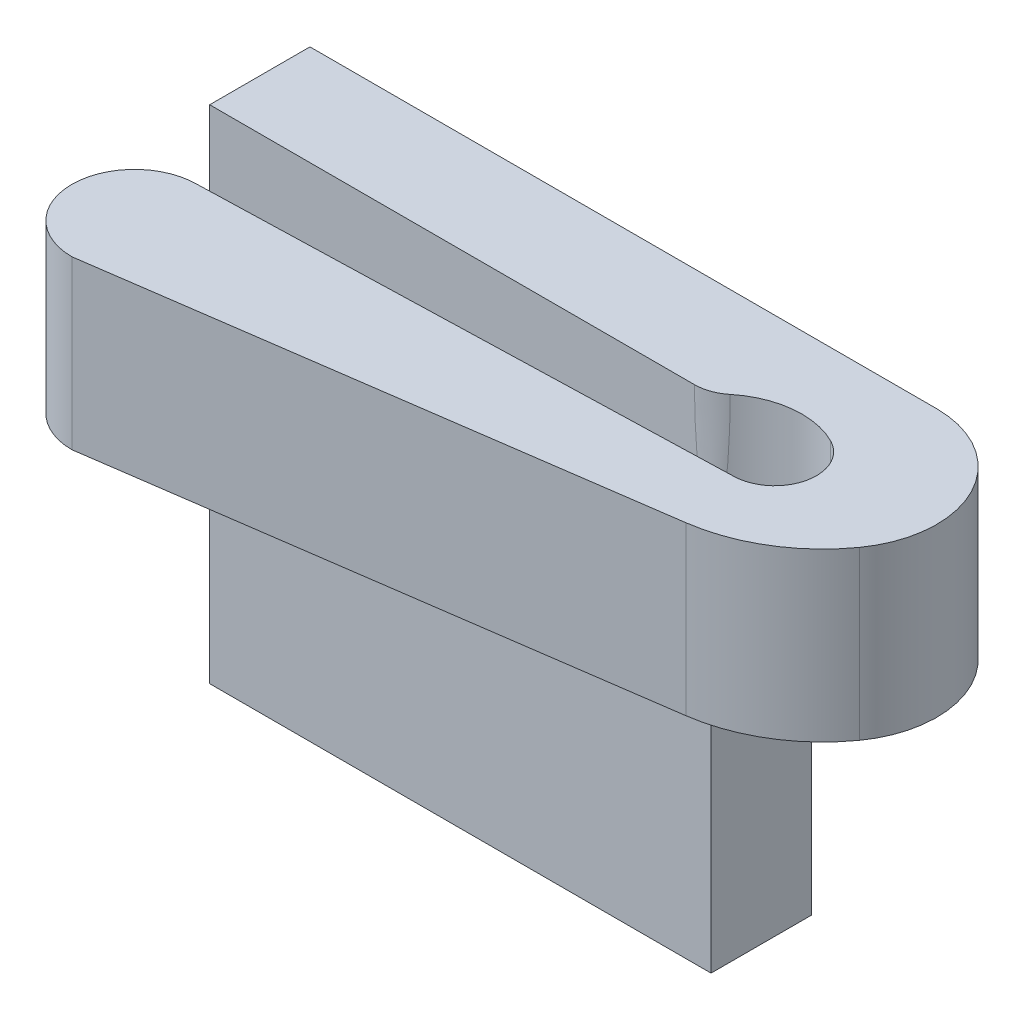
ISO-10303-21;
HEADER;
FILE_DESCRIPTION(('STEP AP214'),'2;1');
FILE_NAME('part.step','',(''),(''),'','','');
FILE_SCHEMA(('AUTOMOTIVE_DESIGN { 1 0 10303 214 1 1 1 1 }'));
ENDSEC;
DATA;
#1=APPLICATION_CONTEXT('core data for automotive mechanical design processes');
#2=APPLICATION_PROTOCOL_DEFINITION('international standard','automotive_design',2000,#1);
#3=PRODUCT_CONTEXT('',#1,'mechanical');
#4=PRODUCT('Part','Part','',(#3));
#5=PRODUCT_RELATED_PRODUCT_CATEGORY('part','',(#4));
#6=PRODUCT_DEFINITION_FORMATION('','',#4);
#7=PRODUCT_DEFINITION_CONTEXT('part definition',#1,'design');
#8=PRODUCT_DEFINITION('design','',#6,#7);
#9=PRODUCT_DEFINITION_SHAPE('','',#8);
#10=(LENGTH_UNIT() NAMED_UNIT(*) SI_UNIT(.MILLI.,.METRE.));
#11=(NAMED_UNIT(*) PLANE_ANGLE_UNIT() SI_UNIT($,.RADIAN.));
#12=(NAMED_UNIT(*) SI_UNIT($,.STERADIAN.) SOLID_ANGLE_UNIT());
#13=UNCERTAINTY_MEASURE_WITH_UNIT(LENGTH_MEASURE(1.E-05),#10,'distance_accuracy_value','');
#14=(GEOMETRIC_REPRESENTATION_CONTEXT(3) GLOBAL_UNCERTAINTY_ASSIGNED_CONTEXT((#13)) GLOBAL_UNIT_ASSIGNED_CONTEXT((#10,
#11,#12)) REPRESENTATION_CONTEXT('',''));
#15=CARTESIAN_POINT('',(0.,0.,0.));
#16=DIRECTION('',(0.,0.,1.));
#17=DIRECTION('',(1.,0.,0.));
#18=AXIS2_PLACEMENT_3D('',#15,#16,#17);
#19=CARTESIAN_POINT('',(6.75,0.,0.661437827766148));
#20=DIRECTION('',(0.,-1.,0.));
#21=DIRECTION('',(0.,0.,-1.));
#22=AXIS2_PLACEMENT_3D('',#19,#20,#21);
#23=PLANE('',#22);
#24=CARTESIAN_POINT('',(6.75,0.,0.661437827766148));
#25=DIRECTION('',(0.,-1.,0.));
#26=DIRECTION('',(0.,0.,-1.));
#27=AXIS2_PLACEMENT_3D('',#24,#25,#26);
#28=CIRCLE('',#27,1.);
#29=CARTESIAN_POINT('',(6.,0.,0.));
#30=VERTEX_POINT('',#29);
#31=CARTESIAN_POINT('',(7.20154343899828,0.,-0.23081130935734));
#32=VERTEX_POINT('',#31);
#33=EDGE_CURVE('E135',#30,#32,#28,.T.);
#34=ORIENTED_EDGE('',*,*,#33,.F.);
#35=DIRECTION('',(0.,0.,-1.));
#36=VECTOR('',#35,1.);
#37=CARTESIAN_POINT('',(6.,0.,0.));
#38=LINE('',#37,#36);
#39=CARTESIAN_POINT('',(6.,0.,-1.2));
#40=VERTEX_POINT('',#39);
#41=EDGE_CURVE('E132',#30,#40,#38,.T.);
#42=ORIENTED_EDGE('',*,*,#41,.T.);
#43=DIRECTION('',(-1.,0.,0.));
#44=VECTOR('',#43,1.);
#45=CARTESIAN_POINT('',(0.,0.,-1.2));
#46=LINE('',#45,#44);
#47=CARTESIAN_POINT('',(7.5,0.,-1.2));
#48=VERTEX_POINT('',#47);
#49=EDGE_CURVE('E162',#48,#40,#46,.T.);
#50=ORIENTED_EDGE('',*,*,#49,.F.);
#51=CARTESIAN_POINT('',(7.5,0.,0.));
#52=DIRECTION('',(0.,1.,0.));
#53=DIRECTION('',(0.,0.,-1.));
#54=AXIS2_PLACEMENT_3D('',#51,#52,#53);
#55=CIRCLE('',#54,1.2);
#56=CARTESIAN_POINT('',(8.4746794344809,0.,0.7));
#57=VERTEX_POINT('',#56);
#58=EDGE_CURVE('E267',#57,#48,#55,.T.);
#59=ORIENTED_EDGE('',*,*,#58,.F.);
#60=CARTESIAN_POINT('',(6.91322451145057,0.,-0.421413264150131));
#61=DIRECTION('',(0.,1.,0.));
#62=DIRECTION('',(0.,0.,-1.));
#63=AXIS2_PLACEMENT_3D('',#60,#61,#62);
#64=CIRCLE('',#63,1.92242273854308);
#65=CARTESIAN_POINT('',(7.1848098971319,0.,1.48172902268809));
#66=VERTEX_POINT('',#65);
#67=EDGE_CURVE('E265',#66,#57,#64,.T.);
#68=ORIENTED_EDGE('',*,*,#67,.F.);
#69=DIRECTION('',(0.989970753404907,0.,-0.141272458047986));
#70=VECTOR('',#69,1.);
#71=CARTESIAN_POINT('',(0.75,0.,2.4));
#72=LINE('',#71,#70);
#73=CARTESIAN_POINT('',(0.75,0.,2.4));
#74=VERTEX_POINT('',#73);
#75=EDGE_CURVE('E258',#74,#66,#72,.T.);
#76=ORIENTED_EDGE('',*,*,#75,.F.);
#77=CARTESIAN_POINT('',(0.75,0.,1.65));
#78=DIRECTION('',(0.,1.,0.));
#79=DIRECTION('',(0.,0.,1.));
#80=AXIS2_PLACEMENT_3D('',#77,#78,#79);
#81=CIRCLE('',#80,0.75);
#82=CARTESIAN_POINT('',(0.75,0.,0.9));
#83=VERTEX_POINT('',#82);
#84=EDGE_CURVE('E254',#83,#74,#81,.T.);
#85=ORIENTED_EDGE('',*,*,#84,.F.);
#86=DIRECTION('',(-0.999561331338217,0.,0.0296166320396508));
#87=VECTOR('',#86,1.);
#88=CARTESIAN_POINT('',(0.75,0.,0.9));
#89=LINE('',#88,#87);
#90=CARTESIAN_POINT('',(6.99058003551897,0.,0.715093924873512));
#91=VERTEX_POINT('',#90);
#92=EDGE_CURVE('E253',#91,#83,#89,.T.);
#93=ORIENTED_EDGE('',*,*,#92,.F.);
#94=CARTESIAN_POINT('',(6.97577171949914,0.,0.215313259204404));
#95=DIRECTION('',(0.,-1.,0.));
#96=DIRECTION('',(0.,0.,-1.));
#97=AXIS2_PLACEMENT_3D('',#94,#95,#96);
#98=CIRCLE('',#97,0.5);
#99=EDGE_CURVE('E45',#91,#32,#98,.F.);
#100=ORIENTED_EDGE('',*,*,#99,.T.);
#101=EDGE_LOOP('',(#34,#42,#50,#59,#68,#76,#85,#93,#100));
#102=FACE_BOUND('',#101,.T.);
#103=ADVANCED_FACE('F37',(#102),#23,.T.);
#104=CARTESIAN_POINT('',(0.,2.,-1.2));
#105=DIRECTION('',(1.,0.,0.));
#106=DIRECTION('',(0.,0.,-1.));
#107=AXIS2_PLACEMENT_3D('',#104,#105,#106);
#108=PLANE('',#107);
#109=DIRECTION('',(0.,-1.,0.));
#110=VECTOR('',#109,1.);
#111=CARTESIAN_POINT('',(0.,2.,-1.2));
#112=LINE('',#111,#110);
#113=CARTESIAN_POINT('',(0.,2.,-1.2));
#114=VERTEX_POINT('',#113);
#115=CARTESIAN_POINT('',(0.,-4.,-1.2));
#116=VERTEX_POINT('',#115);
#117=EDGE_CURVE('E271',#114,#116,#112,.T.);
#118=ORIENTED_EDGE('',*,*,#117,.T.);
#119=DIRECTION('',(0.,0.,-1.));
#120=VECTOR('',#119,1.);
#121=CARTESIAN_POINT('',(0.,-4.,0.));
#122=LINE('',#121,#120);
#123=CARTESIAN_POINT('',(0.,-4.,0.));
#124=VERTEX_POINT('',#123);
#125=EDGE_CURVE('E146',#124,#116,#122,.T.);
#126=ORIENTED_EDGE('',*,*,#125,.F.);
#127=DIRECTION('',(0.,-1.,0.));
#128=VECTOR('',#127,1.);
#129=CARTESIAN_POINT('',(0.,2.,0.));
#130=LINE('',#129,#128);
#131=CARTESIAN_POINT('',(0.,2.,0.));
#132=VERTEX_POINT('',#131);
#133=EDGE_CURVE('E142',#132,#124,#130,.T.);
#134=ORIENTED_EDGE('',*,*,#133,.F.);
#135=DIRECTION('',(0.,0.,1.));
#136=VECTOR('',#135,1.);
#137=CARTESIAN_POINT('',(0.,2.,-1.2));
#138=LINE('',#137,#136);
#139=EDGE_CURVE('E158',#114,#132,#138,.T.);
#140=ORIENTED_EDGE('',*,*,#139,.F.);
#141=EDGE_LOOP('',(#118,#126,#134,#140));
#142=FACE_BOUND('',#141,.T.);
#143=ADVANCED_FACE('F191',(#142),#108,.F.);
#144=CARTESIAN_POINT('',(0.,2.,0.));
#145=DIRECTION('',(0.,0.,-1.));
#146=DIRECTION('',(-1.,0.,0.));
#147=AXIS2_PLACEMENT_3D('',#144,#145,#146);
#148=PLANE('',#147);
#149=ORIENTED_EDGE('',*,*,#133,.T.);
#150=DIRECTION('',(-1.,0.,0.));
#151=VECTOR('',#150,1.);
#152=CARTESIAN_POINT('',(0.,-4.,0.));
#153=LINE('',#152,#151);
#154=CARTESIAN_POINT('',(6.,-4.,0.));
#155=VERTEX_POINT('',#154);
#156=EDGE_CURVE('E139',#155,#124,#153,.T.);
#157=ORIENTED_EDGE('',*,*,#156,.F.);
#158=DIRECTION('',(0.,1.,0.));
#159=VECTOR('',#158,1.);
#160=CARTESIAN_POINT('',(6.,-4.,0.));
#161=LINE('',#160,#159);
#162=EDGE_CURVE('E126',#155,#30,#161,.T.);
#163=ORIENTED_EDGE('',*,*,#162,.T.);
#164=CARTESIAN_POINT('',(5.80075705310292,2.1,0.));
#165=CARTESIAN_POINT('',(5.80075705310292,2.0125,0.));
#166=CARTESIAN_POINT('',(5.80064889285179,1.925,0.));
#167=CARTESIAN_POINT('',(5.80430449907036,1.75,0.));
#168=CARTESIAN_POINT('',(5.80754898956653,1.6625,0.));
#169=CARTESIAN_POINT('',(5.82104555414479,1.4,0.));
#170=CARTESIAN_POINT('',(5.8350504592648,1.225,0.));
#171=CARTESIAN_POINT('',(5.88887699381918,0.7,0.));
#172=CARTESIAN_POINT('',(5.94074877315835,0.350016775933248,0.));
#173=CARTESIAN_POINT('',(6.,0.,0.));
#174=(BOUNDED_CURVE() B_SPLINE_CURVE(3,(#164,#165,#166,#167,#168,#169,#170,#171,#172,#173),
.UNSPECIFIED.,.F.,.F.) B_SPLINE_CURVE_WITH_KNOTS((4,2,2,2,4),(-0.0001,0.0001625,0.000425,
0.00095,0.002),
.UNSPECIFIED.) CURVE() GEOMETRIC_REPRESENTATION_ITEM() RATIONAL_B_SPLINE_CURVE((1.,1.,1.,1.,1.,
0.999999999999999,0.999999999999999,0.999999999999999,0.999999999999999,0.999999999999999)) REPRESENTATION_ITEM(''));
#175=CARTESIAN_POINT('',(5.80082297353879,2.,0.));
#176=VERTEX_POINT('',#175);
#177=EDGE_CURVE('E175',#30,#176,#174,.F.);
#178=ORIENTED_EDGE('',*,*,#177,.T.);
#179=DIRECTION('',(1.,0.,0.));
#180=VECTOR('',#179,1.);
#181=CARTESIAN_POINT('',(0.,2.,0.));
#182=LINE('',#181,#180);
#183=EDGE_CURVE('E161',#132,#176,#182,.T.);
#184=ORIENTED_EDGE('',*,*,#183,.F.);
#185=EDGE_LOOP('',(#149,#157,#163,#178,#184));
#186=FACE_BOUND('',#185,.T.);
#187=ADVANCED_FACE('F140',(#186),#148,.F.);
#188=CARTESIAN_POINT('',(6.75,2.,0.661437827766148));
#189=DIRECTION('',(0.,-1.,0.));
#190=DIRECTION('',(0.,0.,-1.));
#191=AXIS2_PLACEMENT_3D('',#188,#189,#190);
#192=CYLINDRICAL_SURFACE('',#191,1.);
#193=ORIENTED_EDGE('',*,*,#33,.T.);
#194=DIRECTION('',(0.,-1.,0.));
#195=VECTOR('',#194,1.);
#196=CARTESIAN_POINT('',(7.20154343899828,2.,-0.23081130935734));
#197=LINE('',#196,#195);
#198=CARTESIAN_POINT('',(7.20154343899828,2.,-0.23081130935734));
#199=VERTEX_POINT('',#198);
#200=EDGE_CURVE('E58',#32,#199,#197,.F.);
#201=ORIENTED_EDGE('',*,*,#200,.T.);
#202=CARTESIAN_POINT('',(6.75,2.,0.661437827766148));
#203=DIRECTION('',(0.,-1.,0.));
#204=DIRECTION('',(0.,0.,-1.));
#205=AXIS2_PLACEMENT_3D('',#202,#203,#204);
#206=CIRCLE('',#205,1.);
#207=CARTESIAN_POINT('',(6.11713769666248,2.,-0.112826536010414));
#208=VERTEX_POINT('',#207);
#209=EDGE_CURVE('E171',#208,#199,#206,.T.);
#210=ORIENTED_EDGE('',*,*,#209,.F.);
#211=CARTESIAN_POINT('',(6.,0.,0.));
#212=CARTESIAN_POINT('',(6.03918871012658,0.349996349409683,-0.0444358205127169));
#213=CARTESIAN_POINT('',(6.06941650390479,0.7,-0.0717093557990268));
#214=CARTESIAN_POINT('',(6.09917757893462,1.225,-0.0979071848732168));
#215=CARTESIAN_POINT('',(6.10658490223356,1.4,-0.104104171234956));
#216=CARTESIAN_POINT('',(6.11365659452814,1.6625,-0.109974160330728));
#217=CARTESIAN_POINT('',(6.11533703401786,1.75,-0.111352191593892));
#218=CARTESIAN_POINT('',(6.11722833993481,1.925,-0.112901581427313));
#219=CARTESIAN_POINT('',(6.11717136873528,2.0125,-0.112854057411283));
#220=CARTESIAN_POINT('',(6.11717136873528,2.1,-0.112854057411283));
#221=(BOUNDED_CURVE() B_SPLINE_CURVE(3,(#211,#212,#213,#214,#215,#216,#217,#218,#219,#220),
.UNSPECIFIED.,.F.,.F.) B_SPLINE_CURVE_WITH_KNOTS((4,2,2,2,4),(-0.0001,0.00095,0.001475,
0.0017375,0.002),
.UNSPECIFIED.) CURVE() GEOMETRIC_REPRESENTATION_ITEM() RATIONAL_B_SPLINE_CURVE((1.,1.,1.,1.,1.,
1.,1.,1.,1.,1.)) REPRESENTATION_ITEM(''));
#222=EDGE_CURVE('E231',#208,#30,#221,.F.);
#223=ORIENTED_EDGE('',*,*,#222,.T.);
#224=EDGE_LOOP('',(#193,#201,#210,#223));
#225=FACE_BOUND('',#224,.T.);
#226=ADVANCED_FACE('F190',(#225),#192,.F.);
#227=CARTESIAN_POINT('',(0.75,2.,0.9));
#228=DIRECTION('',(0.0296166320396508,0.,0.999561331338217));
#229=DIRECTION('',(0.999561331338217,0.,-0.0296166320396508));
#230=AXIS2_PLACEMENT_3D('',#227,#228,#229);
#231=PLANE('',#230);
#232=DIRECTION('',(-0.999561331338217,0.,0.0296166320396508));
#233=VECTOR('',#232,1.);
#234=CARTESIAN_POINT('',(0.75,2.,0.9));
#235=LINE('',#234,#233);
#236=CARTESIAN_POINT('',(6.99058003551897,2.,0.715093924873512));
#237=VERTEX_POINT('',#236);
#238=CARTESIAN_POINT('',(0.75,2.,0.9));
#239=VERTEX_POINT('',#238);
#240=EDGE_CURVE('E244',#237,#239,#235,.T.);
#241=ORIENTED_EDGE('',*,*,#240,.F.);
#242=DIRECTION('',(0.,1.,0.));
#243=VECTOR('',#242,1.);
#244=CARTESIAN_POINT('',(6.99058003551896,2.,0.715093924873512));
#245=LINE('',#244,#243);
#246=EDGE_CURVE('E233',#237,#91,#245,.F.);
#247=ORIENTED_EDGE('',*,*,#246,.T.);
#248=ORIENTED_EDGE('',*,*,#92,.T.);
#249=DIRECTION('',(0.,-1.,0.));
#250=VECTOR('',#249,1.);
#251=CARTESIAN_POINT('',(0.75,2.,0.9));
#252=LINE('',#251,#250);
#253=EDGE_CURVE('E237',#239,#83,#252,.T.);
#254=ORIENTED_EDGE('',*,*,#253,.F.);
#255=EDGE_LOOP('',(#241,#247,#248,#254));
#256=FACE_BOUND('',#255,.T.);
#257=ADVANCED_FACE('F313',(#256),#231,.F.);
#258=CARTESIAN_POINT('',(0.75,2.,1.65));
#259=DIRECTION('',(0.,-1.,0.));
#260=DIRECTION('',(0.,0.,-1.));
#261=AXIS2_PLACEMENT_3D('',#258,#259,#260);
#262=CYLINDRICAL_SURFACE('',#261,0.75);
#263=ORIENTED_EDGE('',*,*,#84,.T.);
#264=DIRECTION('',(0.,-1.,0.));
#265=VECTOR('',#264,1.);
#266=CARTESIAN_POINT('',(0.75,2.,2.4));
#267=LINE('',#266,#265);
#268=CARTESIAN_POINT('',(0.75,2.,2.4));
#269=VERTEX_POINT('',#268);
#270=EDGE_CURVE('E240',#269,#74,#267,.T.);
#271=ORIENTED_EDGE('',*,*,#270,.F.);
#272=CARTESIAN_POINT('',(0.75,2.,1.65));
#273=DIRECTION('',(0.,1.,0.));
#274=DIRECTION('',(0.,0.,1.));
#275=AXIS2_PLACEMENT_3D('',#272,#273,#274);
#276=CIRCLE('',#275,0.75);
#277=EDGE_CURVE('E309',#239,#269,#276,.T.);
#278=ORIENTED_EDGE('',*,*,#277,.F.);
#279=ORIENTED_EDGE('',*,*,#253,.T.);
#280=EDGE_LOOP('',(#263,#271,#278,#279));
#281=FACE_BOUND('',#280,.T.);
#282=ADVANCED_FACE('F314',(#281),#262,.T.);
#283=CARTESIAN_POINT('',(0.75,2.,2.4));
#284=DIRECTION('',(-0.141272458047986,0.,-0.989970753404907));
#285=DIRECTION('',(-0.989970753404907,0.,0.141272458047986));
#286=AXIS2_PLACEMENT_3D('',#283,#284,#285);
#287=PLANE('',#286);
#288=ORIENTED_EDGE('',*,*,#75,.T.);
#289=DIRECTION('',(0.,-1.,0.));
#290=VECTOR('',#289,1.);
#291=CARTESIAN_POINT('',(7.1848098971319,2.,1.48172902268809));
#292=LINE('',#291,#290);
#293=CARTESIAN_POINT('',(7.1848098971319,2.,1.48172902268809));
#294=VERTEX_POINT('',#293);
#295=EDGE_CURVE('E279',#294,#66,#292,.T.);
#296=ORIENTED_EDGE('',*,*,#295,.F.);
#297=DIRECTION('',(0.989970753404907,0.,-0.141272458047986));
#298=VECTOR('',#297,1.);
#299=CARTESIAN_POINT('',(0.75,2.,2.4));
#300=LINE('',#299,#298);
#301=EDGE_CURVE('E288',#269,#294,#300,.T.);
#302=ORIENTED_EDGE('',*,*,#301,.F.);
#303=ORIENTED_EDGE('',*,*,#270,.T.);
#304=EDGE_LOOP('',(#288,#296,#302,#303));
#305=FACE_BOUND('',#304,.T.);
#306=ADVANCED_FACE('F286',(#305),#287,.F.);
#307=CARTESIAN_POINT('',(6.91322451145057,2.,-0.421413264150131));
#308=DIRECTION('',(0.,-1.,0.));
#309=DIRECTION('',(0.,0.,-1.));
#310=AXIS2_PLACEMENT_3D('',#307,#308,#309);
#311=CYLINDRICAL_SURFACE('',#310,1.92242273854308);
#312=ORIENTED_EDGE('',*,*,#67,.T.);
#313=DIRECTION('',(0.,-1.,0.));
#314=VECTOR('',#313,1.);
#315=CARTESIAN_POINT('',(8.4746794344809,2.,0.7));
#316=LINE('',#315,#314);
#317=CARTESIAN_POINT('',(8.4746794344809,2.,0.7));
#318=VERTEX_POINT('',#317);
#319=EDGE_CURVE('E276',#318,#57,#316,.T.);
#320=ORIENTED_EDGE('',*,*,#319,.F.);
#321=CARTESIAN_POINT('',(6.91322451145057,2.,-0.421413264150131));
#322=DIRECTION('',(0.,1.,0.));
#323=DIRECTION('',(0.,0.,-1.));
#324=AXIS2_PLACEMENT_3D('',#321,#322,#323);
#325=CIRCLE('',#324,1.92242273854308);
#326=EDGE_CURVE('E305',#294,#318,#325,.T.);
#327=ORIENTED_EDGE('',*,*,#326,.F.);
#328=ORIENTED_EDGE('',*,*,#295,.T.);
#329=EDGE_LOOP('',(#312,#320,#327,#328));
#330=FACE_BOUND('',#329,.T.);
#331=ADVANCED_FACE('F297',(#330),#311,.T.);
#332=CARTESIAN_POINT('',(7.5,2.,0.));
#333=DIRECTION('',(0.,-1.,0.));
#334=DIRECTION('',(0.,0.,-1.));
#335=AXIS2_PLACEMENT_3D('',#332,#333,#334);
#336=CYLINDRICAL_SURFACE('',#335,1.2);
#337=ORIENTED_EDGE('',*,*,#58,.T.);
#338=DIRECTION('',(0.,-1.,0.));
#339=VECTOR('',#338,1.);
#340=CARTESIAN_POINT('',(7.5,2.,-1.2));
#341=LINE('',#340,#339);
#342=CARTESIAN_POINT('',(7.5,2.,-1.2));
#343=VERTEX_POINT('',#342);
#344=EDGE_CURVE('E273',#343,#48,#341,.T.);
#345=ORIENTED_EDGE('',*,*,#344,.F.);
#346=CARTESIAN_POINT('',(7.5,2.,0.));
#347=DIRECTION('',(0.,1.,0.));
#348=DIRECTION('',(0.,0.,-1.));
#349=AXIS2_PLACEMENT_3D('',#346,#347,#348);
#350=CIRCLE('',#349,1.2);
#351=EDGE_CURVE('E303',#318,#343,#350,.T.);
#352=ORIENTED_EDGE('',*,*,#351,.F.);
#353=ORIENTED_EDGE('',*,*,#319,.T.);
#354=EDGE_LOOP('',(#337,#345,#352,#353));
#355=FACE_BOUND('',#354,.T.);
#356=ADVANCED_FACE('F301',(#355),#336,.T.);
#357=CARTESIAN_POINT('',(0.,2.,-1.2));
#358=DIRECTION('',(0.,0.,1.));
#359=DIRECTION('',(1.,0.,0.));
#360=AXIS2_PLACEMENT_3D('',#357,#358,#359);
#361=PLANE('',#360);
#362=ORIENTED_EDGE('',*,*,#49,.T.);
#363=DIRECTION('',(0.,1.,0.));
#364=VECTOR('',#363,1.);
#365=CARTESIAN_POINT('',(6.,-4.,-1.2));
#366=LINE('',#365,#364);
#367=CARTESIAN_POINT('',(6.,-4.,-1.2));
#368=VERTEX_POINT('',#367);
#369=EDGE_CURVE('E136',#368,#40,#366,.T.);
#370=ORIENTED_EDGE('',*,*,#369,.F.);
#371=DIRECTION('',(1.,0.,0.));
#372=VECTOR('',#371,1.);
#373=CARTESIAN_POINT('',(0.,-4.,-1.2));
#374=LINE('',#373,#372);
#375=EDGE_CURVE('E150',#116,#368,#374,.T.);
#376=ORIENTED_EDGE('',*,*,#375,.F.);
#377=ORIENTED_EDGE('',*,*,#117,.F.);
#378=DIRECTION('',(-1.,0.,0.));
#379=VECTOR('',#378,1.);
#380=CARTESIAN_POINT('',(0.,2.,-1.2));
#381=LINE('',#380,#379);
#382=EDGE_CURVE('E261',#343,#114,#381,.T.);
#383=ORIENTED_EDGE('',*,*,#382,.F.);
#384=ORIENTED_EDGE('',*,*,#344,.T.);
#385=EDGE_LOOP('',(#362,#370,#376,#377,#383,#384));
#386=FACE_BOUND('',#385,.T.);
#387=ADVANCED_FACE('F330',(#386),#361,.F.);
#388=CARTESIAN_POINT('',(6.75,2.,0.661437827766148));
#389=DIRECTION('',(0.,-1.,0.));
#390=DIRECTION('',(0.,0.,-1.));
#391=AXIS2_PLACEMENT_3D('',#388,#389,#390);
#392=PLANE('',#391);
#393=ORIENTED_EDGE('',*,*,#183,.T.);
#394=CARTESIAN_POINT('',(6.11713759325136,2.00000087234566,-0.112826664770482));
#395=CARTESIAN_POINT('',(5.97910242573817,1.99999729287675,0.));
#396=CARTESIAN_POINT('',(5.80082297140286,2.00000087234566,0.));
#397=(BOUNDED_CURVE() B_SPLINE_CURVE(2,(#394,#395,#396),.UNSPECIFIED.,.F.,
.F.) B_SPLINE_CURVE_WITH_KNOTS((3,3),(0.,1.),
.UNSPECIFIED.) CURVE() GEOMETRIC_REPRESENTATION_ITEM() RATIONAL_B_SPLINE_CURVE((1.,
0.941876985398978,1.)) REPRESENTATION_ITEM(''));
#398=EDGE_CURVE('E229',#176,#208,#397,.F.);
#399=ORIENTED_EDGE('',*,*,#398,.T.);
#400=ORIENTED_EDGE('',*,*,#209,.T.);
#401=CARTESIAN_POINT('',(6.97577171949914,2.,0.215313259204404));
#402=DIRECTION('',(0.,-1.,0.));
#403=DIRECTION('',(0.,0.,-1.));
#404=AXIS2_PLACEMENT_3D('',#401,#402,#403);
#405=CIRCLE('',#404,0.5);
#406=EDGE_CURVE('E11',#199,#237,#405,.T.);
#407=ORIENTED_EDGE('',*,*,#406,.T.);
#408=ORIENTED_EDGE('',*,*,#240,.T.);
#409=ORIENTED_EDGE('',*,*,#277,.T.);
#410=ORIENTED_EDGE('',*,*,#301,.T.);
#411=ORIENTED_EDGE('',*,*,#326,.T.);
#412=ORIENTED_EDGE('',*,*,#351,.T.);
#413=ORIENTED_EDGE('',*,*,#382,.T.);
#414=ORIENTED_EDGE('',*,*,#139,.T.);
#415=EDGE_LOOP('',(#393,#399,#400,#407,#408,#409,#410,#411,#412,#413,#414));
#416=FACE_BOUND('',#415,.T.);
#417=ADVANCED_FACE('F203',(#416),#392,.F.);
#418=CARTESIAN_POINT('',(6.11717136873528,2.1,-0.112854057411283));
#419=CARTESIAN_POINT('',(6.11717136873528,2.0125,-0.112854057411283));
#420=CARTESIAN_POINT('',(6.11722833993481,1.925,-0.112901581427313));
#421=CARTESIAN_POINT('',(6.11533703401786,1.75,-0.111352191593892));
#422=CARTESIAN_POINT('',(6.11365659452814,1.6625,-0.109974160330728));
#423=CARTESIAN_POINT('',(6.10658490223356,1.4,-0.104104171234956));
#424=CARTESIAN_POINT('',(6.09917757893462,1.225,-0.0979071848732168));
#425=CARTESIAN_POINT('',(6.06941650390479,0.7,-0.0717093557990268));
#426=CARTESIAN_POINT('',(6.03918871012658,0.349996349409683,-0.0444358205127169));
#427=CARTESIAN_POINT('',(6.,0.,0.));
#428=CARTESIAN_POINT('',(5.97908978306449,2.1,0.));
#429=CARTESIAN_POINT('',(5.97908978306449,2.01249999999999,0.));
#430=CARTESIAN_POINT('',(5.97907063634323,1.92498089412601,0.));
#431=CARTESIAN_POINT('',(5.97975326359724,1.7499808857787,0.));
#432=CARTESIAN_POINT('',(5.98035780913368,1.66245164799768,0.));
#433=CARTESIAN_POINT('',(5.98279270097487,1.3998062708298,0.));
#434=CARTESIAN_POINT('',(5.98526093109735,1.22456460817174,0.));
#435=CARTESIAN_POINT('',(5.99337986292844,0.698245336121559,0.));
#436=CARTESIAN_POINT('',(5.9999999940443,0.345403880476077,0.));
#437=CARTESIAN_POINT('',(6.,0.,0.));
#438=CARTESIAN_POINT('',(5.80075705310292,2.1,0.));
#439=CARTESIAN_POINT('',(5.80075705310292,2.0125,0.));
#440=CARTESIAN_POINT('',(5.80064889285179,1.925,0.));
#441=CARTESIAN_POINT('',(5.80430449907036,1.75,0.));
#442=CARTESIAN_POINT('',(5.80754898956653,1.6625,0.));
#443=CARTESIAN_POINT('',(5.82104555414479,1.4,0.));
#444=CARTESIAN_POINT('',(5.83505045926479,1.225,0.));
#445=CARTESIAN_POINT('',(5.88887699381918,0.7,0.));
#446=CARTESIAN_POINT('',(5.94074877315835,0.350016775933248,0.));
#447=CARTESIAN_POINT('',(6.,0.,0.));
#448=(BOUNDED_SURFACE() B_SPLINE_SURFACE(2,3,((#418,#419,#420,#421,#422,#423,#424,#425,#426,
#427),(#428,#429,#430,#431,#432,#433,#434,#435,#436,#437),(#438,#439,#440,#441,#442,#443,#444,
#445,#446,#447)),.UNSPECIFIED.,.F.,.F.,.F.) B_SPLINE_SURFACE_WITH_KNOTS((3,3),(4,2,2,2,4),(0.,
1.),(-0.0001,0.0001625,0.000425,0.00095,0.002),
.UNSPECIFIED.) GEOMETRIC_REPRESENTATION_ITEM() RATIONAL_B_SPLINE_SURFACE(((1.,1.,1.,1.,1.,1.,1.,
1.,1.,1.),(0.941884251162911,0.941884251162911,0.941896887625032,0.941485555893411,
0.941119686629204,0.93955951447124,0.937911483925057,0.93091104399815,0.923565882585686,
0.911437827766148),(1.,1.,1.,1.,1.,1.,1.,1.,1.,1.))) REPRESENTATION_ITEM('') SURFACE());
#449=ORIENTED_EDGE('',*,*,#398,.F.);
#450=ORIENTED_EDGE('',*,*,#177,.F.);
#451=ORIENTED_EDGE('',*,*,#222,.F.);
#452=EDGE_LOOP('',(#449,#450,#451));
#453=FACE_BOUND('',#452,.T.);
#454=ADVANCED_FACE('F197',(#453),#448,.T.);
#455=CARTESIAN_POINT('',(6.,-4.,0.));
#456=DIRECTION('',(1.,0.,0.));
#457=DIRECTION('',(0.,0.,-1.));
#458=AXIS2_PLACEMENT_3D('',#455,#456,#457);
#459=PLANE('',#458);
#460=ORIENTED_EDGE('',*,*,#41,.F.);
#461=ORIENTED_EDGE('',*,*,#162,.F.);
#462=DIRECTION('',(0.,0.,-1.));
#463=VECTOR('',#462,1.);
#464=CARTESIAN_POINT('',(6.,-4.,0.));
#465=LINE('',#464,#463);
#466=EDGE_CURVE('E130',#155,#368,#465,.T.);
#467=ORIENTED_EDGE('',*,*,#466,.T.);
#468=ORIENTED_EDGE('',*,*,#369,.T.);
#469=EDGE_LOOP('',(#460,#461,#467,#468));
#470=FACE_BOUND('',#469,.T.);
#471=ADVANCED_FACE('F128',(#470),#459,.T.);
#472=CARTESIAN_POINT('',(0.,-4.,0.));
#473=DIRECTION('',(0.,-1.,0.));
#474=DIRECTION('',(0.,0.,-1.));
#475=AXIS2_PLACEMENT_3D('',#472,#473,#474);
#476=PLANE('',#475);
#477=ORIENTED_EDGE('',*,*,#466,.F.);
#478=ORIENTED_EDGE('',*,*,#156,.T.);
#479=ORIENTED_EDGE('',*,*,#125,.T.);
#480=ORIENTED_EDGE('',*,*,#375,.T.);
#481=EDGE_LOOP('',(#477,#478,#479,#480));
#482=FACE_BOUND('',#481,.T.);
#483=ADVANCED_FACE('F148',(#482),#476,.T.);
#484=CARTESIAN_POINT('',(6.97577171949914,2.,0.215313259204404));
#485=DIRECTION('',(0.,-1.,0.));
#486=DIRECTION('',(0.,0.,-1.));
#487=AXIS2_PLACEMENT_3D('',#484,#485,#486);
#488=CYLINDRICAL_SURFACE('',#487,0.5);
#489=ORIENTED_EDGE('',*,*,#406,.F.);
#490=ORIENTED_EDGE('',*,*,#200,.F.);
#491=ORIENTED_EDGE('',*,*,#99,.F.);
#492=ORIENTED_EDGE('',*,*,#246,.F.);
#493=EDGE_LOOP('',(#489,#490,#491,#492));
#494=FACE_BOUND('',#493,.T.);
#495=ADVANCED_FACE('F39',(#494),#488,.F.);
#496=CLOSED_SHELL('',(#103,#143,#187,#226,#257,#282,#306,#331,#356,#387,#417,#454,#471,#483,#495));
#497=MANIFOLD_SOLID_BREP('B2',#496);
#498=ADVANCED_BREP_SHAPE_REPRESENTATION('',(#18,#497),#14);
#499=SHAPE_DEFINITION_REPRESENTATION(#9,#498);
ENDSEC;
END-ISO-10303-21;
